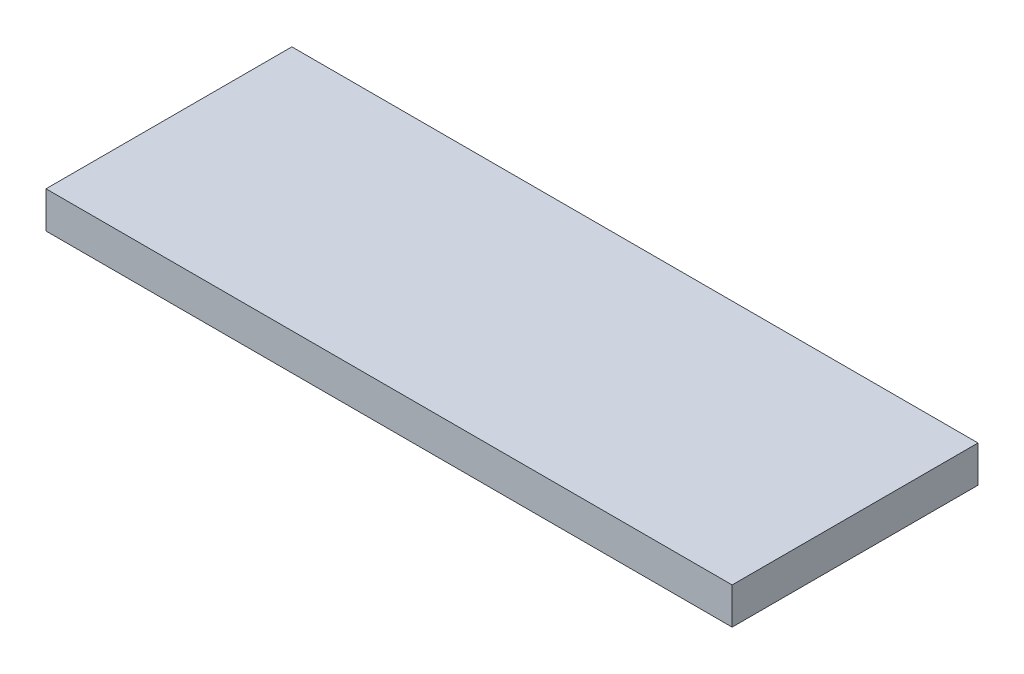
ISO-10303-21;
HEADER;
FILE_DESCRIPTION(('STEP AP214'),'2;1');
FILE_NAME('part.step','',(''),(''),'','','');
FILE_SCHEMA(('AUTOMOTIVE_DESIGN { 1 0 10303 214 1 1 1 1 }'));
ENDSEC;
DATA;
#1=APPLICATION_CONTEXT('core data for automotive mechanical design processes');
#2=APPLICATION_PROTOCOL_DEFINITION('international standard','automotive_design',2000,#1);
#3=PRODUCT_CONTEXT('',#1,'mechanical');
#4=PRODUCT('Part','Part','',(#3));
#5=PRODUCT_RELATED_PRODUCT_CATEGORY('part','',(#4));
#6=PRODUCT_DEFINITION_FORMATION('','',#4);
#7=PRODUCT_DEFINITION_CONTEXT('part definition',#1,'design');
#8=PRODUCT_DEFINITION('design','',#6,#7);
#9=PRODUCT_DEFINITION_SHAPE('','',#8);
#10=(LENGTH_UNIT() NAMED_UNIT(*) SI_UNIT(.MILLI.,.METRE.));
#11=(NAMED_UNIT(*) PLANE_ANGLE_UNIT() SI_UNIT($,.RADIAN.));
#12=(NAMED_UNIT(*) SI_UNIT($,.STERADIAN.) SOLID_ANGLE_UNIT());
#13=UNCERTAINTY_MEASURE_WITH_UNIT(LENGTH_MEASURE(1.E-05),#10,'distance_accuracy_value','');
#14=(GEOMETRIC_REPRESENTATION_CONTEXT(3) GLOBAL_UNCERTAINTY_ASSIGNED_CONTEXT((#13)) GLOBAL_UNIT_ASSIGNED_CONTEXT((#10,
#11,#12)) REPRESENTATION_CONTEXT('',''));
#15=CARTESIAN_POINT('',(0.,0.,0.));
#16=DIRECTION('',(0.,0.,1.));
#17=DIRECTION('',(1.,0.,0.));
#18=AXIS2_PLACEMENT_3D('',#15,#16,#17);
#19=CARTESIAN_POINT('',(0.,1.6,0.));
#20=DIRECTION('',(1.,0.,0.));
#21=DIRECTION('',(0.,0.,-1.));
#22=AXIS2_PLACEMENT_3D('',#19,#20,#21);
#23=PLANE('',#22);
#24=DIRECTION('',(0.,0.,1.));
#25=VECTOR('',#24,1.);
#26=CARTESIAN_POINT('',(0.,0.,0.));
#27=LINE('',#26,#25);
#28=CARTESIAN_POINT('',(0.,0.,-10.75));
#29=VERTEX_POINT('',#28);
#30=CARTESIAN_POINT('',(0.,0.,0.));
#31=VERTEX_POINT('',#30);
#32=EDGE_CURVE('E96',#29,#31,#27,.T.);
#33=ORIENTED_EDGE('',*,*,#32,.T.);
#34=DIRECTION('',(0.,-1.,0.));
#35=VECTOR('',#34,1.);
#36=CARTESIAN_POINT('',(0.,1.6,0.));
#37=LINE('',#36,#35);
#38=CARTESIAN_POINT('',(0.,1.6,0.));
#39=VERTEX_POINT('',#38);
#40=EDGE_CURVE('E11',#39,#31,#37,.T.);
#41=ORIENTED_EDGE('',*,*,#40,.F.);
#42=DIRECTION('',(0.,0.,1.));
#43=VECTOR('',#42,1.);
#44=CARTESIAN_POINT('',(0.,1.6,0.));
#45=LINE('',#44,#43);
#46=CARTESIAN_POINT('',(0.,1.6,-10.75));
#47=VERTEX_POINT('',#46);
#48=EDGE_CURVE('E84',#47,#39,#45,.T.);
#49=ORIENTED_EDGE('',*,*,#48,.F.);
#50=DIRECTION('',(0.,-1.,0.));
#51=VECTOR('',#50,1.);
#52=CARTESIAN_POINT('',(0.,1.6,-10.75));
#53=LINE('',#52,#51);
#54=EDGE_CURVE('E92',#47,#29,#53,.T.);
#55=ORIENTED_EDGE('',*,*,#54,.T.);
#56=EDGE_LOOP('',(#33,#41,#49,#55));
#57=FACE_BOUND('',#56,.T.);
#58=ADVANCED_FACE('F33',(#57),#23,.F.);
#59=CARTESIAN_POINT('',(0.,1.6,0.));
#60=DIRECTION('',(0.,0.,-1.));
#61=DIRECTION('',(-1.,0.,0.));
#62=AXIS2_PLACEMENT_3D('',#59,#60,#61);
#63=PLANE('',#62);
#64=DIRECTION('',(1.,0.,0.));
#65=VECTOR('',#64,1.);
#66=CARTESIAN_POINT('',(0.,0.,0.));
#67=LINE('',#66,#65);
#68=CARTESIAN_POINT('',(30.,0.,0.));
#69=VERTEX_POINT('',#68);
#70=EDGE_CURVE('E88',#31,#69,#67,.T.);
#71=ORIENTED_EDGE('',*,*,#70,.T.);
#72=DIRECTION('',(0.,-1.,0.));
#73=VECTOR('',#72,1.);
#74=CARTESIAN_POINT('',(30.,1.6,0.));
#75=LINE('',#74,#73);
#76=CARTESIAN_POINT('',(30.,1.6,0.));
#77=VERTEX_POINT('',#76);
#78=EDGE_CURVE('E41',#77,#69,#75,.T.);
#79=ORIENTED_EDGE('',*,*,#78,.F.);
#80=DIRECTION('',(1.,0.,0.));
#81=VECTOR('',#80,1.);
#82=CARTESIAN_POINT('',(0.,1.6,0.));
#83=LINE('',#82,#81);
#84=EDGE_CURVE('E79',#39,#77,#83,.T.);
#85=ORIENTED_EDGE('',*,*,#84,.F.);
#86=ORIENTED_EDGE('',*,*,#40,.T.);
#87=EDGE_LOOP('',(#71,#79,#85,#86));
#88=FACE_BOUND('',#87,.T.);
#89=ADVANCED_FACE('F87',(#88),#63,.F.);
#90=CARTESIAN_POINT('',(30.,1.6,0.));
#91=DIRECTION('',(-1.,0.,0.));
#92=DIRECTION('',(0.,0.,1.));
#93=AXIS2_PLACEMENT_3D('',#90,#91,#92);
#94=PLANE('',#93);
#95=DIRECTION('',(0.,0.,-1.));
#96=VECTOR('',#95,1.);
#97=CARTESIAN_POINT('',(30.,0.,0.));
#98=LINE('',#97,#96);
#99=CARTESIAN_POINT('',(30.,0.,-10.75));
#100=VERTEX_POINT('',#99);
#101=EDGE_CURVE('E66',#69,#100,#98,.T.);
#102=ORIENTED_EDGE('',*,*,#101,.T.);
#103=DIRECTION('',(0.,-1.,0.));
#104=VECTOR('',#103,1.);
#105=CARTESIAN_POINT('',(30.,1.6,-10.75));
#106=LINE('',#105,#104);
#107=CARTESIAN_POINT('',(30.,1.6,-10.75));
#108=VERTEX_POINT('',#107);
#109=EDGE_CURVE('E89',#108,#100,#106,.T.);
#110=ORIENTED_EDGE('',*,*,#109,.F.);
#111=DIRECTION('',(0.,0.,-1.));
#112=VECTOR('',#111,1.);
#113=CARTESIAN_POINT('',(30.,1.6,0.));
#114=LINE('',#113,#112);
#115=EDGE_CURVE('E82',#77,#108,#114,.T.);
#116=ORIENTED_EDGE('',*,*,#115,.F.);
#117=ORIENTED_EDGE('',*,*,#78,.T.);
#118=EDGE_LOOP('',(#102,#110,#116,#117));
#119=FACE_BOUND('',#118,.T.);
#120=ADVANCED_FACE('F90',(#119),#94,.F.);
#121=CARTESIAN_POINT('',(0.,1.6,-10.75));
#122=DIRECTION('',(0.,0.,1.));
#123=DIRECTION('',(1.,0.,0.));
#124=AXIS2_PLACEMENT_3D('',#121,#122,#123);
#125=PLANE('',#124);
#126=DIRECTION('',(-1.,0.,0.));
#127=VECTOR('',#126,1.);
#128=CARTESIAN_POINT('',(0.,0.,-10.75));
#129=LINE('',#128,#127);
#130=EDGE_CURVE('E72',#100,#29,#129,.T.);
#131=ORIENTED_EDGE('',*,*,#130,.T.);
#132=ORIENTED_EDGE('',*,*,#54,.F.);
#133=DIRECTION('',(-1.,0.,0.));
#134=VECTOR('',#133,1.);
#135=CARTESIAN_POINT('',(0.,1.6,-10.75));
#136=LINE('',#135,#134);
#137=EDGE_CURVE('E49',#108,#47,#136,.T.);
#138=ORIENTED_EDGE('',*,*,#137,.F.);
#139=ORIENTED_EDGE('',*,*,#109,.T.);
#140=EDGE_LOOP('',(#131,#132,#138,#139));
#141=FACE_BOUND('',#140,.T.);
#142=ADVANCED_FACE('F103',(#141),#125,.F.);
#143=CARTESIAN_POINT('',(0.,1.6,0.));
#144=DIRECTION('',(0.,-1.,0.));
#145=DIRECTION('',(0.,0.,-1.));
#146=AXIS2_PLACEMENT_3D('',#143,#144,#145);
#147=PLANE('',#146);
#148=ORIENTED_EDGE('',*,*,#48,.T.);
#149=ORIENTED_EDGE('',*,*,#84,.T.);
#150=ORIENTED_EDGE('',*,*,#115,.T.);
#151=ORIENTED_EDGE('',*,*,#137,.T.);
#152=EDGE_LOOP('',(#148,#149,#150,#151));
#153=FACE_BOUND('',#152,.T.);
#154=ADVANCED_FACE('F80',(#153),#147,.F.);
#155=CARTESIAN_POINT('',(0.,0.,0.));
#156=DIRECTION('',(0.,-1.,0.));
#157=DIRECTION('',(0.,0.,-1.));
#158=AXIS2_PLACEMENT_3D('',#155,#156,#157);
#159=PLANE('',#158);
#160=ORIENTED_EDGE('',*,*,#32,.F.);
#161=ORIENTED_EDGE('',*,*,#130,.F.);
#162=ORIENTED_EDGE('',*,*,#101,.F.);
#163=ORIENTED_EDGE('',*,*,#70,.F.);
#164=EDGE_LOOP('',(#160,#161,#162,#163));
#165=FACE_BOUND('',#164,.T.);
#166=ADVANCED_FACE('F106',(#165),#159,.T.);
#167=CLOSED_SHELL('',(#58,#89,#120,#142,#154,#166));
#168=MANIFOLD_SOLID_BREP('B2',#167);
#169=ADVANCED_BREP_SHAPE_REPRESENTATION('',(#18,#168),#14);
#170=SHAPE_DEFINITION_REPRESENTATION(#9,#169);
ENDSEC;
END-ISO-10303-21;
